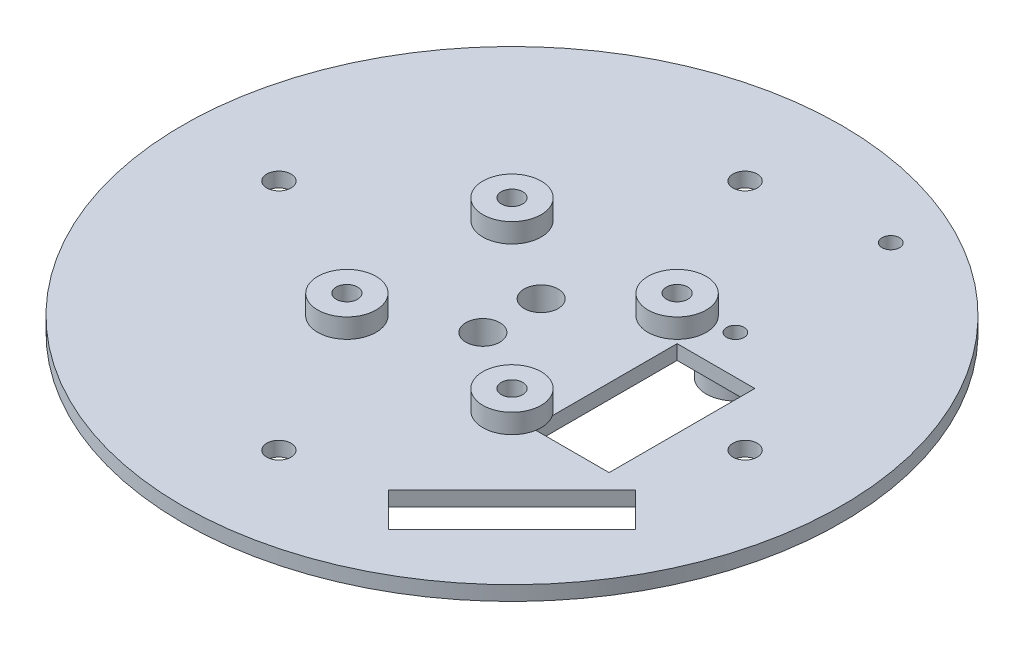
ISO-10303-21;
HEADER;
FILE_DESCRIPTION(('STEP AP214'),'2;1');
FILE_NAME('part.step','',(''),(''),'','','');
FILE_SCHEMA(('AUTOMOTIVE_DESIGN { 1 0 10303 214 1 1 1 1 }'));
ENDSEC;
DATA;
#1=APPLICATION_CONTEXT('core data for automotive mechanical design processes');
#2=APPLICATION_PROTOCOL_DEFINITION('international standard','automotive_design',2000,#1);
#3=PRODUCT_CONTEXT('',#1,'mechanical');
#4=PRODUCT('Part','Part','',(#3));
#5=PRODUCT_RELATED_PRODUCT_CATEGORY('part','',(#4));
#6=PRODUCT_DEFINITION_FORMATION('','',#4);
#7=PRODUCT_DEFINITION_CONTEXT('part definition',#1,'design');
#8=PRODUCT_DEFINITION('design','',#6,#7);
#9=PRODUCT_DEFINITION_SHAPE('','',#8);
#10=(LENGTH_UNIT() NAMED_UNIT(*) SI_UNIT(.MILLI.,.METRE.));
#11=(NAMED_UNIT(*) PLANE_ANGLE_UNIT() SI_UNIT($,.RADIAN.));
#12=(NAMED_UNIT(*) SI_UNIT($,.STERADIAN.) SOLID_ANGLE_UNIT());
#13=UNCERTAINTY_MEASURE_WITH_UNIT(LENGTH_MEASURE(1.E-05),#10,'distance_accuracy_value','');
#14=(GEOMETRIC_REPRESENTATION_CONTEXT(3) GLOBAL_UNCERTAINTY_ASSIGNED_CONTEXT((#13)) GLOBAL_UNIT_ASSIGNED_CONTEXT((#10,
#11,#12)) REPRESENTATION_CONTEXT('',''));
#15=CARTESIAN_POINT('',(0.,0.,0.));
#16=DIRECTION('',(0.,0.,1.));
#17=DIRECTION('',(1.,0.,0.));
#18=AXIS2_PLACEMENT_3D('',#15,#16,#17);
#19=CARTESIAN_POINT('',(0.,0.,0.));
#20=DIRECTION('',(0.,1.,0.));
#21=DIRECTION('',(0.,0.,1.));
#22=AXIS2_PLACEMENT_3D('',#19,#20,#21);
#23=PLANE('',#22);
#24=CARTESIAN_POINT('',(13.,0.,-26.));
#25=DIRECTION('',(0.,1.,0.));
#26=DIRECTION('',(0.,0.,1.));
#27=AXIS2_PLACEMENT_3D('',#24,#25,#26);
#28=CIRCLE('',#27,3.);
#29=CARTESIAN_POINT('',(13.,0.,-23.));
#30=VERTEX_POINT('',#29);
#31=EDGE_CURVE('E43',#30,#30,#28,.F.);
#32=ORIENTED_EDGE('',*,*,#31,.F.);
#33=EDGE_LOOP('',(#32));
#34=FACE_BOUND('',#33,.T.);
#35=CARTESIAN_POINT('',(-8.5,0.,8.5));
#36=DIRECTION('',(0.,1.,0.));
#37=DIRECTION('',(0.,0.,1.));
#38=AXIS2_PLACEMENT_3D('',#35,#36,#37);
#39=CIRCLE('',#38,1.1);
#40=CARTESIAN_POINT('',(-8.5,0.,9.6));
#41=VERTEX_POINT('',#40);
#42=EDGE_CURVE('E195',#41,#41,#39,.T.);
#43=ORIENTED_EDGE('',*,*,#42,.T.);
#44=EDGE_LOOP('',(#43));
#45=FACE_BOUND('',#44,.T.);
#46=CARTESIAN_POINT('',(8.5,0.,8.5));
#47=DIRECTION('',(0.,1.,0.));
#48=DIRECTION('',(0.,0.,-1.));
#49=AXIS2_PLACEMENT_3D('',#46,#47,#48);
#50=CIRCLE('',#49,1.1);
#51=CARTESIAN_POINT('',(8.5,0.,7.4));
#52=VERTEX_POINT('',#51);
#53=EDGE_CURVE('E200',#52,#52,#50,.T.);
#54=ORIENTED_EDGE('',*,*,#53,.T.);
#55=EDGE_LOOP('',(#54));
#56=FACE_BOUND('',#55,.T.);
#57=CARTESIAN_POINT('',(-8.5,0.,-8.5));
#58=DIRECTION('',(0.,1.,0.));
#59=DIRECTION('',(0.,0.,-1.));
#60=AXIS2_PLACEMENT_3D('',#57,#58,#59);
#61=CIRCLE('',#60,1.1);
#62=CARTESIAN_POINT('',(-8.5,0.,-9.6));
#63=VERTEX_POINT('',#62);
#64=EDGE_CURVE('E203',#63,#63,#61,.T.);
#65=ORIENTED_EDGE('',*,*,#64,.T.);
#66=EDGE_LOOP('',(#65));
#67=FACE_BOUND('',#66,.T.);
#68=CARTESIAN_POINT('',(8.5,0.,-8.5));
#69=DIRECTION('',(0.,1.,0.));
#70=DIRECTION('',(0.,0.,1.));
#71=AXIS2_PLACEMENT_3D('',#68,#69,#70);
#72=CIRCLE('',#71,1.1);
#73=CARTESIAN_POINT('',(8.5,0.,-7.4));
#74=VERTEX_POINT('',#73);
#75=EDGE_CURVE('E206',#74,#74,#72,.T.);
#76=ORIENTED_EDGE('',*,*,#75,.T.);
#77=EDGE_LOOP('',(#76));
#78=FACE_BOUND('',#77,.T.);
#79=CARTESIAN_POINT('',(-24.,0.,0.));
#80=DIRECTION('',(0.,1.,0.));
#81=DIRECTION('',(0.,0.,1.));
#82=AXIS2_PLACEMENT_3D('',#79,#80,#81);
#83=CIRCLE('',#82,1.25);
#84=CARTESIAN_POINT('',(-24.,0.,1.25));
#85=VERTEX_POINT('',#84);
#86=EDGE_CURVE('E209',#85,#85,#83,.T.);
#87=ORIENTED_EDGE('',*,*,#86,.T.);
#88=EDGE_LOOP('',(#87));
#89=FACE_BOUND('',#88,.T.);
#90=CARTESIAN_POINT('',(0.,0.,24.));
#91=DIRECTION('',(0.,1.,0.));
#92=DIRECTION('',(0.,0.,1.));
#93=AXIS2_PLACEMENT_3D('',#90,#91,#92);
#94=CIRCLE('',#93,1.25);
#95=CARTESIAN_POINT('',(0.,0.,25.25));
#96=VERTEX_POINT('',#95);
#97=EDGE_CURVE('E213',#96,#96,#94,.T.);
#98=ORIENTED_EDGE('',*,*,#97,.T.);
#99=EDGE_LOOP('',(#98));
#100=FACE_BOUND('',#99,.T.);
#101=CARTESIAN_POINT('',(24.,0.,0.));
#102=DIRECTION('',(0.,1.,0.));
#103=DIRECTION('',(0.,0.,1.));
#104=AXIS2_PLACEMENT_3D('',#101,#102,#103);
#105=CIRCLE('',#104,1.25);
#106=CARTESIAN_POINT('',(24.,0.,1.25));
#107=VERTEX_POINT('',#106);
#108=EDGE_CURVE('E219',#107,#107,#105,.T.);
#109=ORIENTED_EDGE('',*,*,#108,.T.);
#110=EDGE_LOOP('',(#109));
#111=FACE_BOUND('',#110,.T.);
#112=CARTESIAN_POINT('',(0.,0.,-24.));
#113=DIRECTION('',(0.,1.,0.));
#114=DIRECTION('',(0.,0.,1.));
#115=AXIS2_PLACEMENT_3D('',#112,#113,#114);
#116=CIRCLE('',#115,1.25);
#117=CARTESIAN_POINT('',(0.,0.,-22.75));
#118=VERTEX_POINT('',#117);
#119=EDGE_CURVE('E225',#118,#118,#116,.T.);
#120=ORIENTED_EDGE('',*,*,#119,.T.);
#121=EDGE_LOOP('',(#120));
#122=FACE_BOUND('',#121,.T.);
#123=DIRECTION('',(0.,0.,1.));
#124=VECTOR('',#123,1.);
#125=CARTESIAN_POINT('',(11.,0.,-6.));
#126=LINE('',#125,#124);
#127=CARTESIAN_POINT('',(11.,0.,-6.));
#128=VERTEX_POINT('',#127);
#129=CARTESIAN_POINT('',(11.,0.,9.));
#130=VERTEX_POINT('',#129);
#131=EDGE_CURVE('E231',#128,#130,#126,.T.);
#132=ORIENTED_EDGE('',*,*,#131,.T.);
#133=DIRECTION('',(1.,0.,0.));
#134=VECTOR('',#133,1.);
#135=CARTESIAN_POINT('',(11.,0.,9.));
#136=LINE('',#135,#134);
#137=CARTESIAN_POINT('',(19.,0.,9.));
#138=VERTEX_POINT('',#137);
#139=EDGE_CURVE('E250',#130,#138,#136,.T.);
#140=ORIENTED_EDGE('',*,*,#139,.T.);
#141=DIRECTION('',(0.,0.,-1.));
#142=VECTOR('',#141,1.);
#143=CARTESIAN_POINT('',(19.,0.,-6.));
#144=LINE('',#143,#142);
#145=CARTESIAN_POINT('',(19.,0.,-6.));
#146=VERTEX_POINT('',#145);
#147=EDGE_CURVE('E253',#138,#146,#144,.T.);
#148=ORIENTED_EDGE('',*,*,#147,.T.);
#149=DIRECTION('',(-1.,0.,0.));
#150=VECTOR('',#149,1.);
#151=CARTESIAN_POINT('',(11.,0.,-6.));
#152=LINE('',#151,#150);
#153=EDGE_CURVE('E238',#146,#128,#152,.T.);
#154=ORIENTED_EDGE('',*,*,#153,.T.);
#155=EDGE_LOOP('',(#132,#140,#148,#154));
#156=FACE_BOUND('',#155,.T.);
#157=CARTESIAN_POINT('',(0.,0.,0.));
#158=DIRECTION('',(0.,1.,0.));
#159=DIRECTION('',(0.,0.,1.));
#160=AXIS2_PLACEMENT_3D('',#157,#158,#159);
#161=CIRCLE('',#160,33.9299851282316);
#162=CARTESIAN_POINT('',(0.,0.,33.9299851282316));
#163=VERTEX_POINT('',#162);
#164=EDGE_CURVE('E310',#163,#163,#161,.T.);
#165=ORIENTED_EDGE('',*,*,#164,.F.);
#166=EDGE_LOOP('',(#165));
#167=FACE_BOUND('',#166,.T.);
#168=DIRECTION('',(-0.707106781186545,0.,-0.70710678118655));
#169=VECTOR('',#168,1.);
#170=CARTESIAN_POINT('',(25.4558441227156,0.,12.7279220613579));
#171=LINE('',#170,#169);
#172=CARTESIAN_POINT('',(25.4558441227156,0.,12.7279220613579));
#173=VERTEX_POINT('',#172);
#174=CARTESIAN_POINT('',(21.9203102167829,0.,9.19238815542524));
#175=VERTEX_POINT('',#174);
#176=EDGE_CURVE('E270',#173,#175,#171,.T.);
#177=ORIENTED_EDGE('',*,*,#176,.T.);
#178=DIRECTION('',(-0.707106781186555,0.,0.70710678118654));
#179=VECTOR('',#178,1.);
#180=CARTESIAN_POINT('',(21.9203102167829,0.,9.19238815542524));
#181=LINE('',#180,#179);
#182=CARTESIAN_POINT('',(9.19238815542494,0.,21.920310216783));
#183=VERTEX_POINT('',#182);
#184=EDGE_CURVE('E284',#175,#183,#181,.T.);
#185=ORIENTED_EDGE('',*,*,#184,.T.);
#186=DIRECTION('',(0.707106781186544,0.,0.707106781186551));
#187=VECTOR('',#186,1.);
#188=CARTESIAN_POINT('',(9.19238815542494,0.,21.920310216783));
#189=LINE('',#188,#187);
#190=CARTESIAN_POINT('',(12.7279220613577,0.,25.4558441227157));
#191=VERTEX_POINT('',#190);
#192=EDGE_CURVE('E287',#183,#191,#189,.T.);
#193=ORIENTED_EDGE('',*,*,#192,.T.);
#194=DIRECTION('',(0.707106781186551,0.,-0.707106781186544));
#195=VECTOR('',#194,1.);
#196=CARTESIAN_POINT('',(12.7279220613577,0.,25.4558441227157));
#197=LINE('',#196,#195);
#198=EDGE_CURVE('E274',#191,#173,#197,.T.);
#199=ORIENTED_EDGE('',*,*,#198,.T.);
#200=EDGE_LOOP('',(#177,#185,#193,#199));
#201=FACE_BOUND('',#200,.T.);
#202=DIRECTION('',(0.,0.,1.));
#203=VECTOR('',#202,1.);
#204=CARTESIAN_POINT('',(5.,0.,8.));
#205=LINE('',#204,#203);
#206=CARTESIAN_POINT('',(5.,0.,-7.));
#207=VERTEX_POINT('',#206);
#208=CARTESIAN_POINT('',(5.,0.,8.));
#209=VERTEX_POINT('',#208);
#210=EDGE_CURVE('E151',#207,#209,#205,.T.);
#211=ORIENTED_EDGE('',*,*,#210,.F.);
#212=DIRECTION('',(1.,0.,0.));
#213=VECTOR('',#212,1.);
#214=CARTESIAN_POINT('',(-5.,0.,-7.));
#215=LINE('',#214,#213);
#216=CARTESIAN_POINT('',(-5.,0.,-7.));
#217=VERTEX_POINT('',#216);
#218=EDGE_CURVE('E148',#217,#207,#215,.T.);
#219=ORIENTED_EDGE('',*,*,#218,.F.);
#220=DIRECTION('',(0.,0.,-1.));
#221=VECTOR('',#220,1.);
#222=CARTESIAN_POINT('',(-5.,0.,8.));
#223=LINE('',#222,#221);
#224=CARTESIAN_POINT('',(-5.,0.,8.));
#225=VERTEX_POINT('',#224);
#226=EDGE_CURVE('E55',#225,#217,#223,.T.);
#227=ORIENTED_EDGE('',*,*,#226,.F.);
#228=DIRECTION('',(-1.,0.,0.));
#229=VECTOR('',#228,1.);
#230=CARTESIAN_POINT('',(5.,0.,8.));
#231=LINE('',#230,#229);
#232=EDGE_CURVE('E50',#209,#225,#231,.T.);
#233=ORIENTED_EDGE('',*,*,#232,.F.);
#234=EDGE_LOOP('',(#211,#219,#227,#233));
#235=FACE_BOUND('',#234,.T.);
#236=CARTESIAN_POINT('',(13.,0.,-10.));
#237=DIRECTION('',(0.,1.,0.));
#238=DIRECTION('',(0.,0.,1.));
#239=AXIS2_PLACEMENT_3D('',#236,#237,#238);
#240=CIRCLE('',#239,3.);
#241=CARTESIAN_POINT('',(13.,0.,-7.));
#242=VERTEX_POINT('',#241);
#243=EDGE_CURVE('E11',#242,#242,#240,.F.);
#244=ORIENTED_EDGE('',*,*,#243,.F.);
#245=EDGE_LOOP('',(#244));
#246=FACE_BOUND('',#245,.T.);
#247=ADVANCED_FACE('F35',(#34,#45,#56,#67,#78,#89,#100,#111,#122,#156,#167,#201,#235,#246),#23,.F.);
#248=CARTESIAN_POINT('',(0.,1.5,0.));
#249=DIRECTION('',(0.,1.,0.));
#250=DIRECTION('',(0.,0.,1.));
#251=AXIS2_PLACEMENT_3D('',#248,#249,#250);
#252=PLANE('',#251);
#253=DIRECTION('',(1.,0.,0.));
#254=VECTOR('',#253,1.);
#255=CARTESIAN_POINT('',(11.,1.5,9.));
#256=LINE('',#255,#254);
#257=CARTESIAN_POINT('',(11.4580398915498,1.5,9.));
#258=VERTEX_POINT('',#257);
#259=CARTESIAN_POINT('',(19.,1.5,9.));
#260=VERTEX_POINT('',#259);
#261=EDGE_CURVE('E237',#258,#260,#256,.T.);
#262=ORIENTED_EDGE('',*,*,#261,.F.);
#263=CARTESIAN_POINT('',(8.5,1.5,8.5));
#264=DIRECTION('',(0.,1.,0.));
#265=DIRECTION('',(0.,0.,1.));
#266=AXIS2_PLACEMENT_3D('',#263,#264,#265);
#267=CIRCLE('',#266,3.);
#268=CARTESIAN_POINT('',(11.,1.5,6.8416876048223));
#269=VERTEX_POINT('',#268);
#270=EDGE_CURVE('E169',#269,#258,#267,.T.);
#271=ORIENTED_EDGE('',*,*,#270,.F.);
#272=DIRECTION('',(0.,0.,1.));
#273=VECTOR('',#272,1.);
#274=CARTESIAN_POINT('',(11.,1.5,-6.));
#275=LINE('',#274,#273);
#276=CARTESIAN_POINT('',(11.,1.5,-6.));
#277=VERTEX_POINT('',#276);
#278=EDGE_CURVE('E234',#277,#269,#275,.T.);
#279=ORIENTED_EDGE('',*,*,#278,.F.);
#280=DIRECTION('',(-1.,0.,0.));
#281=VECTOR('',#280,1.);
#282=CARTESIAN_POINT('',(11.,1.5,-6.));
#283=LINE('',#282,#281);
#284=CARTESIAN_POINT('',(19.,1.5,-6.));
#285=VERTEX_POINT('',#284);
#286=EDGE_CURVE('E245',#285,#277,#283,.T.);
#287=ORIENTED_EDGE('',*,*,#286,.F.);
#288=DIRECTION('',(0.,0.,-1.));
#289=VECTOR('',#288,1.);
#290=CARTESIAN_POINT('',(19.,1.5,-6.));
#291=LINE('',#290,#289);
#292=EDGE_CURVE('E242',#260,#285,#291,.T.);
#293=ORIENTED_EDGE('',*,*,#292,.F.);
#294=EDGE_LOOP('',(#262,#271,#279,#287,#293));
#295=FACE_BOUND('',#294,.T.);
#296=CARTESIAN_POINT('',(-8.5,1.5,-8.5));
#297=DIRECTION('',(0.,1.,0.));
#298=DIRECTION('',(0.,0.,1.));
#299=AXIS2_PLACEMENT_3D('',#296,#297,#298);
#300=CIRCLE('',#299,3.);
#301=CARTESIAN_POINT('',(-8.5,1.5,-5.5));
#302=VERTEX_POINT('',#301);
#303=EDGE_CURVE('E191',#302,#302,#300,.T.);
#304=ORIENTED_EDGE('',*,*,#303,.F.);
#305=EDGE_LOOP('',(#304));
#306=FACE_BOUND('',#305,.T.);
#307=CARTESIAN_POINT('',(0.,1.5,24.));
#308=DIRECTION('',(0.,1.,0.));
#309=DIRECTION('',(0.,0.,1.));
#310=AXIS2_PLACEMENT_3D('',#307,#308,#309);
#311=CIRCLE('',#310,1.25);
#312=CARTESIAN_POINT('',(0.,1.5,25.25));
#313=VERTEX_POINT('',#312);
#314=EDGE_CURVE('E216',#313,#313,#311,.T.);
#315=ORIENTED_EDGE('',*,*,#314,.F.);
#316=EDGE_LOOP('',(#315));
#317=FACE_BOUND('',#316,.T.);
#318=CARTESIAN_POINT('',(0.,1.5,-24.));
#319=DIRECTION('',(0.,1.,0.));
#320=DIRECTION('',(0.,0.,1.));
#321=AXIS2_PLACEMENT_3D('',#318,#319,#320);
#322=CIRCLE('',#321,1.25);
#323=CARTESIAN_POINT('',(0.,1.5,-22.75));
#324=VERTEX_POINT('',#323);
#325=EDGE_CURVE('E228',#324,#324,#322,.T.);
#326=ORIENTED_EDGE('',*,*,#325,.F.);
#327=EDGE_LOOP('',(#326));
#328=FACE_BOUND('',#327,.T.);
#329=DIRECTION('',(-0.707106781186555,0.,0.70710678118654));
#330=VECTOR('',#329,1.);
#331=CARTESIAN_POINT('',(21.9203102167829,1.5,9.19238815542524));
#332=LINE('',#331,#330);
#333=CARTESIAN_POINT('',(21.9203102167829,1.5,9.19238815542524));
#334=VERTEX_POINT('',#333);
#335=CARTESIAN_POINT('',(9.19238815542494,1.5,21.920310216783));
#336=VERTEX_POINT('',#335);
#337=EDGE_CURVE('E273',#334,#336,#332,.T.);
#338=ORIENTED_EDGE('',*,*,#337,.F.);
#339=DIRECTION('',(-0.707106781186545,0.,-0.70710678118655));
#340=VECTOR('',#339,1.);
#341=CARTESIAN_POINT('',(25.4558441227156,1.5,12.7279220613579));
#342=LINE('',#341,#340);
#343=CARTESIAN_POINT('',(25.4558441227156,1.5,12.7279220613579));
#344=VERTEX_POINT('',#343);
#345=EDGE_CURVE('E271',#344,#334,#342,.T.);
#346=ORIENTED_EDGE('',*,*,#345,.F.);
#347=DIRECTION('',(0.707106781186551,0.,-0.707106781186544));
#348=VECTOR('',#347,1.);
#349=CARTESIAN_POINT('',(12.7279220613577,1.5,25.4558441227157));
#350=LINE('',#349,#348);
#351=CARTESIAN_POINT('',(12.7279220613577,1.5,25.4558441227157));
#352=VERTEX_POINT('',#351);
#353=EDGE_CURVE('E279',#352,#344,#350,.T.);
#354=ORIENTED_EDGE('',*,*,#353,.F.);
#355=DIRECTION('',(0.707106781186544,0.,0.707106781186551));
#356=VECTOR('',#355,1.);
#357=CARTESIAN_POINT('',(9.19238815542494,1.5,21.920310216783));
#358=LINE('',#357,#356);
#359=EDGE_CURVE('E276',#336,#352,#358,.T.);
#360=ORIENTED_EDGE('',*,*,#359,.F.);
#361=EDGE_LOOP('',(#338,#346,#354,#360));
#362=FACE_BOUND('',#361,.T.);
#363=CARTESIAN_POINT('',(13.,1.5,-10.));
#364=DIRECTION('',(0.,1.,0.));
#365=DIRECTION('',(0.,0.,1.));
#366=AXIS2_PLACEMENT_3D('',#363,#364,#365);
#367=CIRCLE('',#366,0.900000000000002);
#368=CARTESIAN_POINT('',(13.,1.5,-9.1));
#369=VERTEX_POINT('',#368);
#370=EDGE_CURVE('E301',#369,#369,#367,.T.);
#371=ORIENTED_EDGE('',*,*,#370,.F.);
#372=EDGE_LOOP('',(#371));
#373=FACE_BOUND('',#372,.T.);
#374=CARTESIAN_POINT('',(0.,1.5,-3.));
#375=DIRECTION('',(0.,1.,0.));
#376=DIRECTION('',(0.,0.,1.));
#377=AXIS2_PLACEMENT_3D('',#374,#375,#376);
#378=CIRCLE('',#377,1.75);
#379=CARTESIAN_POINT('',(0.,1.5,-1.25));
#380=VERTEX_POINT('',#379);
#381=EDGE_CURVE('E307',#380,#380,#378,.T.);
#382=ORIENTED_EDGE('',*,*,#381,.F.);
#383=EDGE_LOOP('',(#382));
#384=FACE_BOUND('',#383,.T.);
#385=CARTESIAN_POINT('',(0.,1.5,0.));
#386=DIRECTION('',(0.,1.,0.));
#387=DIRECTION('',(0.,0.,1.));
#388=AXIS2_PLACEMENT_3D('',#385,#386,#387);
#389=CIRCLE('',#388,33.9299851282316);
#390=CARTESIAN_POINT('',(0.,1.5,33.9299851282316));
#391=VERTEX_POINT('',#390);
#392=EDGE_CURVE('E311',#391,#391,#389,.T.);
#393=ORIENTED_EDGE('',*,*,#392,.T.);
#394=EDGE_LOOP('',(#393));
#395=FACE_BOUND('',#394,.T.);
#396=CARTESIAN_POINT('',(0.,1.5,3.));
#397=DIRECTION('',(0.,1.,0.));
#398=DIRECTION('',(0.,0.,1.));
#399=AXIS2_PLACEMENT_3D('',#396,#397,#398);
#400=CIRCLE('',#399,1.75);
#401=CARTESIAN_POINT('',(0.,1.5,4.75));
#402=VERTEX_POINT('',#401);
#403=EDGE_CURVE('E304',#402,#402,#400,.T.);
#404=ORIENTED_EDGE('',*,*,#403,.F.);
#405=EDGE_LOOP('',(#404));
#406=FACE_BOUND('',#405,.T.);
#407=CARTESIAN_POINT('',(13.,1.5,-26.));
#408=DIRECTION('',(0.,1.,0.));
#409=DIRECTION('',(0.,0.,-1.));
#410=AXIS2_PLACEMENT_3D('',#407,#408,#409);
#411=CIRCLE('',#410,0.900000000000004);
#412=CARTESIAN_POINT('',(13.,1.5,-26.9));
#413=VERTEX_POINT('',#412);
#414=EDGE_CURVE('E267',#413,#413,#411,.T.);
#415=ORIENTED_EDGE('',*,*,#414,.F.);
#416=EDGE_LOOP('',(#415));
#417=FACE_BOUND('',#416,.T.);
#418=CARTESIAN_POINT('',(24.,1.5,0.));
#419=DIRECTION('',(0.,1.,0.));
#420=DIRECTION('',(0.,0.,1.));
#421=AXIS2_PLACEMENT_3D('',#418,#419,#420);
#422=CIRCLE('',#421,1.25);
#423=CARTESIAN_POINT('',(24.,1.5,1.25));
#424=VERTEX_POINT('',#423);
#425=EDGE_CURVE('E222',#424,#424,#422,.T.);
#426=ORIENTED_EDGE('',*,*,#425,.F.);
#427=EDGE_LOOP('',(#426));
#428=FACE_BOUND('',#427,.T.);
#429=CARTESIAN_POINT('',(-24.,1.5,0.));
#430=DIRECTION('',(0.,1.,0.));
#431=DIRECTION('',(0.,0.,1.));
#432=AXIS2_PLACEMENT_3D('',#429,#430,#431);
#433=CIRCLE('',#432,1.25);
#434=CARTESIAN_POINT('',(-24.,1.5,1.25));
#435=VERTEX_POINT('',#434);
#436=EDGE_CURVE('E210',#435,#435,#433,.T.);
#437=ORIENTED_EDGE('',*,*,#436,.F.);
#438=EDGE_LOOP('',(#437));
#439=FACE_BOUND('',#438,.T.);
#440=CARTESIAN_POINT('',(8.5,1.5,-8.5));
#441=DIRECTION('',(0.,1.,0.));
#442=DIRECTION('',(0.,0.,1.));
#443=AXIS2_PLACEMENT_3D('',#440,#441,#442);
#444=CIRCLE('',#443,3.);
#445=CARTESIAN_POINT('',(8.5,1.5,-5.5));
#446=VERTEX_POINT('',#445);
#447=EDGE_CURVE('E182',#446,#446,#444,.T.);
#448=ORIENTED_EDGE('',*,*,#447,.F.);
#449=EDGE_LOOP('',(#448));
#450=FACE_BOUND('',#449,.T.);
#451=CARTESIAN_POINT('',(-8.5,1.5,8.5));
#452=DIRECTION('',(0.,1.,0.));
#453=DIRECTION('',(0.,0.,1.));
#454=AXIS2_PLACEMENT_3D('',#451,#452,#453);
#455=CIRCLE('',#454,3.);
#456=CARTESIAN_POINT('',(-8.5,1.5,11.5));
#457=VERTEX_POINT('',#456);
#458=EDGE_CURVE('E155',#457,#457,#455,.T.);
#459=ORIENTED_EDGE('',*,*,#458,.F.);
#460=EDGE_LOOP('',(#459));
#461=FACE_BOUND('',#460,.T.);
#462=ADVANCED_FACE('F322',(#295,#306,#317,#328,#362,#373,#384,#395,#406,#417,#428,#439,#450,
#461),#252,.T.);
#463=CARTESIAN_POINT('',(0.,1.5,0.));
#464=DIRECTION('',(0.,-1.,0.));
#465=DIRECTION('',(0.,0.,-1.));
#466=AXIS2_PLACEMENT_3D('',#463,#464,#465);
#467=CYLINDRICAL_SURFACE('',#466,33.9299851282316);
#468=ORIENTED_EDGE('',*,*,#392,.F.);
#469=EDGE_LOOP('',(#468));
#470=FACE_BOUND('',#469,.T.);
#471=ORIENTED_EDGE('',*,*,#164,.T.);
#472=EDGE_LOOP('',(#471));
#473=FACE_BOUND('',#472,.T.);
#474=ADVANCED_FACE('F37',(#470,#473),#467,.T.);
#475=CARTESIAN_POINT('',(0.,1.5,-3.));
#476=DIRECTION('',(0.,-1.,0.));
#477=DIRECTION('',(0.,0.,-1.));
#478=AXIS2_PLACEMENT_3D('',#475,#476,#477);
#479=CYLINDRICAL_SURFACE('',#478,1.75);
#480=ORIENTED_EDGE('',*,*,#381,.T.);
#481=EDGE_LOOP('',(#480));
#482=FACE_BOUND('',#481,.T.);
#483=CARTESIAN_POINT('',(0.,-1.,-3.));
#484=DIRECTION('',(0.,-1.,0.));
#485=DIRECTION('',(0.,0.,-1.));
#486=AXIS2_PLACEMENT_3D('',#483,#484,#485);
#487=CIRCLE('',#486,1.75);
#488=CARTESIAN_POINT('',(0.,-1.,-4.75));
#489=VERTEX_POINT('',#488);
#490=EDGE_CURVE('E546',#489,#489,#487,.T.);
#491=ORIENTED_EDGE('',*,*,#490,.T.);
#492=EDGE_LOOP('',(#491));
#493=FACE_BOUND('',#492,.T.);
#494=ADVANCED_FACE('F491',(#482,#493),#479,.F.);
#495=CARTESIAN_POINT('',(0.,1.5,3.));
#496=DIRECTION('',(0.,-1.,0.));
#497=DIRECTION('',(0.,0.,-1.));
#498=AXIS2_PLACEMENT_3D('',#495,#496,#497);
#499=CYLINDRICAL_SURFACE('',#498,1.75);
#500=ORIENTED_EDGE('',*,*,#403,.T.);
#501=EDGE_LOOP('',(#500));
#502=FACE_BOUND('',#501,.T.);
#503=CARTESIAN_POINT('',(0.,-1.,3.));
#504=DIRECTION('',(0.,-1.,0.));
#505=DIRECTION('',(0.,0.,-1.));
#506=AXIS2_PLACEMENT_3D('',#503,#504,#505);
#507=CIRCLE('',#506,1.75);
#508=CARTESIAN_POINT('',(0.,-1.,1.25));
#509=VERTEX_POINT('',#508);
#510=EDGE_CURVE('E555',#509,#509,#507,.T.);
#511=ORIENTED_EDGE('',*,*,#510,.T.);
#512=EDGE_LOOP('',(#511));
#513=FACE_BOUND('',#512,.T.);
#514=ADVANCED_FACE('F487',(#502,#513),#499,.F.);
#515=CARTESIAN_POINT('',(13.,1.5,-10.));
#516=DIRECTION('',(0.,-1.,0.));
#517=DIRECTION('',(0.,0.,-1.));
#518=AXIS2_PLACEMENT_3D('',#515,#516,#517);
#519=CYLINDRICAL_SURFACE('',#518,0.900000000000002);
#520=ORIENTED_EDGE('',*,*,#370,.T.);
#521=EDGE_LOOP('',(#520));
#522=FACE_BOUND('',#521,.T.);
#523=CARTESIAN_POINT('',(13.,-2.5,-10.));
#524=DIRECTION('',(0.,-1.,0.));
#525=DIRECTION('',(0.,0.,-1.));
#526=AXIS2_PLACEMENT_3D('',#523,#524,#525);
#527=CIRCLE('',#526,0.900000000000002);
#528=CARTESIAN_POINT('',(13.,-2.5,-10.9));
#529=VERTEX_POINT('',#528);
#530=EDGE_CURVE('E549',#529,#529,#527,.T.);
#531=ORIENTED_EDGE('',*,*,#530,.T.);
#532=EDGE_LOOP('',(#531));
#533=FACE_BOUND('',#532,.T.);
#534=ADVANCED_FACE('F483',(#522,#533),#519,.F.);
#535=CARTESIAN_POINT('',(25.4558441227156,1.5,12.7279220613579));
#536=DIRECTION('',(-0.70710678118655,0.,0.707106781186544));
#537=DIRECTION('',(0.707106781186545,0.,0.70710678118655));
#538=AXIS2_PLACEMENT_3D('',#535,#536,#537);
#539=PLANE('',#538);
#540=ORIENTED_EDGE('',*,*,#176,.F.);
#541=DIRECTION('',(0.,-1.,0.));
#542=VECTOR('',#541,1.);
#543=CARTESIAN_POINT('',(25.4558441227156,1.5,12.7279220613579));
#544=LINE('',#543,#542);
#545=EDGE_CURVE('E281',#344,#173,#544,.T.);
#546=ORIENTED_EDGE('',*,*,#545,.F.);
#547=ORIENTED_EDGE('',*,*,#345,.T.);
#548=DIRECTION('',(0.,-1.,0.));
#549=VECTOR('',#548,1.);
#550=CARTESIAN_POINT('',(21.9203102167829,1.5,9.19238815542524));
#551=LINE('',#550,#549);
#552=EDGE_CURVE('E298',#334,#175,#551,.T.);
#553=ORIENTED_EDGE('',*,*,#552,.T.);
#554=EDGE_LOOP('',(#540,#546,#547,#553));
#555=FACE_BOUND('',#554,.T.);
#556=ADVANCED_FACE('F479',(#555),#539,.T.);
#557=CARTESIAN_POINT('',(21.9203102167829,1.5,9.19238815542524));
#558=DIRECTION('',(0.70710678118654,0.,0.707106781186555));
#559=DIRECTION('',(0.707106781186555,0.,-0.70710678118654));
#560=AXIS2_PLACEMENT_3D('',#557,#558,#559);
#561=PLANE('',#560);
#562=ORIENTED_EDGE('',*,*,#184,.F.);
#563=ORIENTED_EDGE('',*,*,#552,.F.);
#564=ORIENTED_EDGE('',*,*,#337,.T.);
#565=DIRECTION('',(0.,-1.,0.));
#566=VECTOR('',#565,1.);
#567=CARTESIAN_POINT('',(9.19238815542494,1.5,21.920310216783));
#568=LINE('',#567,#566);
#569=EDGE_CURVE('E296',#336,#183,#568,.T.);
#570=ORIENTED_EDGE('',*,*,#569,.T.);
#571=EDGE_LOOP('',(#562,#563,#564,#570));
#572=FACE_BOUND('',#571,.T.);
#573=ADVANCED_FACE('F475',(#572),#561,.T.);
#574=CARTESIAN_POINT('',(9.19238815542494,1.5,21.920310216783));
#575=DIRECTION('',(0.707106781186551,0.,-0.707106781186544));
#576=DIRECTION('',(-0.707106781186544,0.,-0.707106781186551));
#577=AXIS2_PLACEMENT_3D('',#574,#575,#576);
#578=PLANE('',#577);
#579=ORIENTED_EDGE('',*,*,#192,.F.);
#580=ORIENTED_EDGE('',*,*,#569,.F.);
#581=ORIENTED_EDGE('',*,*,#359,.T.);
#582=DIRECTION('',(0.,-1.,0.));
#583=VECTOR('',#582,1.);
#584=CARTESIAN_POINT('',(12.7279220613577,1.5,25.4558441227157));
#585=LINE('',#584,#583);
#586=EDGE_CURVE('E294',#352,#191,#585,.T.);
#587=ORIENTED_EDGE('',*,*,#586,.T.);
#588=EDGE_LOOP('',(#579,#580,#581,#587));
#589=FACE_BOUND('',#588,.T.);
#590=ADVANCED_FACE('F471',(#589),#578,.T.);
#591=CARTESIAN_POINT('',(12.7279220613577,1.5,25.4558441227157));
#592=DIRECTION('',(-0.707106781186544,0.,-0.707106781186551));
#593=DIRECTION('',(-0.707106781186551,0.,0.707106781186544));
#594=AXIS2_PLACEMENT_3D('',#591,#592,#593);
#595=PLANE('',#594);
#596=ORIENTED_EDGE('',*,*,#198,.F.);
#597=ORIENTED_EDGE('',*,*,#586,.F.);
#598=ORIENTED_EDGE('',*,*,#353,.T.);
#599=ORIENTED_EDGE('',*,*,#545,.T.);
#600=EDGE_LOOP('',(#596,#597,#598,#599));
#601=FACE_BOUND('',#600,.T.);
#602=ADVANCED_FACE('F467',(#601),#595,.T.);
#603=CARTESIAN_POINT('',(13.,1.5,-26.));
#604=DIRECTION('',(0.,-1.,0.));
#605=DIRECTION('',(0.,0.,-1.));
#606=AXIS2_PLACEMENT_3D('',#603,#604,#605);
#607=CYLINDRICAL_SURFACE('',#606,0.900000000000004);
#608=ORIENTED_EDGE('',*,*,#414,.T.);
#609=EDGE_LOOP('',(#608));
#610=FACE_BOUND('',#609,.T.);
#611=CARTESIAN_POINT('',(13.,-2.5,-26.));
#612=DIRECTION('',(0.,-1.,0.));
#613=DIRECTION('',(0.,0.,-1.));
#614=AXIS2_PLACEMENT_3D('',#611,#612,#613);
#615=CIRCLE('',#614,0.900000000000006);
#616=CARTESIAN_POINT('',(13.,-2.5,-26.9));
#617=VERTEX_POINT('',#616);
#618=EDGE_CURVE('E540',#617,#617,#615,.T.);
#619=ORIENTED_EDGE('',*,*,#618,.T.);
#620=EDGE_LOOP('',(#619));
#621=FACE_BOUND('',#620,.T.);
#622=ADVANCED_FACE('F463',(#610,#621),#607,.F.);
#623=CARTESIAN_POINT('',(11.,1.5,-6.));
#624=DIRECTION('',(1.,0.,0.));
#625=DIRECTION('',(0.,0.,-1.));
#626=AXIS2_PLACEMENT_3D('',#623,#624,#625);
#627=PLANE('',#626);
#628=ORIENTED_EDGE('',*,*,#131,.F.);
#629=DIRECTION('',(0.,-1.,0.));
#630=VECTOR('',#629,1.);
#631=CARTESIAN_POINT('',(11.,1.5,-6.));
#632=LINE('',#631,#630);
#633=EDGE_CURVE('E247',#277,#128,#632,.T.);
#634=ORIENTED_EDGE('',*,*,#633,.F.);
#635=ORIENTED_EDGE('',*,*,#278,.T.);
#636=DIRECTION('',(0.,0.,1.));
#637=VECTOR('',#636,1.);
#638=CARTESIAN_POINT('',(11.,1.5,-6.));
#639=LINE('',#638,#637);
#640=CARTESIAN_POINT('',(11.,1.5,9.));
#641=VERTEX_POINT('',#640);
#642=EDGE_CURVE('E173',#269,#641,#639,.T.);
#643=ORIENTED_EDGE('',*,*,#642,.T.);
#644=DIRECTION('',(0.,-1.,0.));
#645=VECTOR('',#644,1.);
#646=CARTESIAN_POINT('',(11.,1.5,9.));
#647=LINE('',#646,#645);
#648=EDGE_CURVE('E264',#641,#130,#647,.T.);
#649=ORIENTED_EDGE('',*,*,#648,.T.);
#650=EDGE_LOOP('',(#628,#634,#635,#643,#649));
#651=FACE_BOUND('',#650,.T.);
#652=ADVANCED_FACE('F459',(#651),#627,.T.);
#653=CARTESIAN_POINT('',(11.,1.5,9.));
#654=DIRECTION('',(0.,0.,-1.));
#655=DIRECTION('',(-1.,0.,0.));
#656=AXIS2_PLACEMENT_3D('',#653,#654,#655);
#657=PLANE('',#656);
#658=ORIENTED_EDGE('',*,*,#139,.F.);
#659=ORIENTED_EDGE('',*,*,#648,.F.);
#660=EDGE_CURVE('E239',#641,#258,#256,.T.);
#661=ORIENTED_EDGE('',*,*,#660,.T.);
#662=ORIENTED_EDGE('',*,*,#261,.T.);
#663=DIRECTION('',(0.,-1.,0.));
#664=VECTOR('',#663,1.);
#665=CARTESIAN_POINT('',(19.,1.5,9.));
#666=LINE('',#665,#664);
#667=EDGE_CURVE('E262',#260,#138,#666,.T.);
#668=ORIENTED_EDGE('',*,*,#667,.T.);
#669=EDGE_LOOP('',(#658,#659,#661,#662,#668));
#670=FACE_BOUND('',#669,.T.);
#671=ADVANCED_FACE('F455',(#670),#657,.T.);
#672=CARTESIAN_POINT('',(19.,1.5,-6.));
#673=DIRECTION('',(-1.,0.,0.));
#674=DIRECTION('',(0.,0.,1.));
#675=AXIS2_PLACEMENT_3D('',#672,#673,#674);
#676=PLANE('',#675);
#677=ORIENTED_EDGE('',*,*,#147,.F.);
#678=ORIENTED_EDGE('',*,*,#667,.F.);
#679=ORIENTED_EDGE('',*,*,#292,.T.);
#680=DIRECTION('',(0.,-1.,0.));
#681=VECTOR('',#680,1.);
#682=CARTESIAN_POINT('',(19.,1.5,-6.));
#683=LINE('',#682,#681);
#684=EDGE_CURVE('E260',#285,#146,#683,.T.);
#685=ORIENTED_EDGE('',*,*,#684,.T.);
#686=EDGE_LOOP('',(#677,#678,#679,#685));
#687=FACE_BOUND('',#686,.T.);
#688=ADVANCED_FACE('F451',(#687),#676,.T.);
#689=CARTESIAN_POINT('',(11.,1.5,-6.));
#690=DIRECTION('',(0.,0.,1.));
#691=DIRECTION('',(1.,0.,0.));
#692=AXIS2_PLACEMENT_3D('',#689,#690,#691);
#693=PLANE('',#692);
#694=ORIENTED_EDGE('',*,*,#153,.F.);
#695=ORIENTED_EDGE('',*,*,#684,.F.);
#696=ORIENTED_EDGE('',*,*,#286,.T.);
#697=ORIENTED_EDGE('',*,*,#633,.T.);
#698=EDGE_LOOP('',(#694,#695,#696,#697));
#699=FACE_BOUND('',#698,.T.);
#700=ADVANCED_FACE('F447',(#699),#693,.T.);
#701=CARTESIAN_POINT('',(0.,1.5,-24.));
#702=DIRECTION('',(0.,-1.,0.));
#703=DIRECTION('',(0.,0.,-1.));
#704=AXIS2_PLACEMENT_3D('',#701,#702,#703);
#705=CYLINDRICAL_SURFACE('',#704,1.25);
#706=ORIENTED_EDGE('',*,*,#325,.T.);
#707=EDGE_LOOP('',(#706));
#708=FACE_BOUND('',#707,.T.);
#709=ORIENTED_EDGE('',*,*,#119,.F.);
#710=EDGE_LOOP('',(#709));
#711=FACE_BOUND('',#710,.T.);
#712=ADVANCED_FACE('F443',(#708,#711),#705,.F.);
#713=CARTESIAN_POINT('',(24.,1.5,0.));
#714=DIRECTION('',(0.,-1.,0.));
#715=DIRECTION('',(0.,0.,-1.));
#716=AXIS2_PLACEMENT_3D('',#713,#714,#715);
#717=CYLINDRICAL_SURFACE('',#716,1.25);
#718=ORIENTED_EDGE('',*,*,#425,.T.);
#719=EDGE_LOOP('',(#718));
#720=FACE_BOUND('',#719,.T.);
#721=ORIENTED_EDGE('',*,*,#108,.F.);
#722=EDGE_LOOP('',(#721));
#723=FACE_BOUND('',#722,.T.);
#724=ADVANCED_FACE('F439',(#720,#723),#717,.F.);
#725=CARTESIAN_POINT('',(0.,1.5,24.));
#726=DIRECTION('',(0.,-1.,0.));
#727=DIRECTION('',(0.,0.,-1.));
#728=AXIS2_PLACEMENT_3D('',#725,#726,#727);
#729=CYLINDRICAL_SURFACE('',#728,1.25);
#730=ORIENTED_EDGE('',*,*,#314,.T.);
#731=EDGE_LOOP('',(#730));
#732=FACE_BOUND('',#731,.T.);
#733=ORIENTED_EDGE('',*,*,#97,.F.);
#734=EDGE_LOOP('',(#733));
#735=FACE_BOUND('',#734,.T.);
#736=ADVANCED_FACE('F435',(#732,#735),#729,.F.);
#737=CARTESIAN_POINT('',(-24.,1.5,0.));
#738=DIRECTION('',(0.,-1.,0.));
#739=DIRECTION('',(0.,0.,-1.));
#740=AXIS2_PLACEMENT_3D('',#737,#738,#739);
#741=CYLINDRICAL_SURFACE('',#740,1.25);
#742=ORIENTED_EDGE('',*,*,#436,.T.);
#743=EDGE_LOOP('',(#742));
#744=FACE_BOUND('',#743,.T.);
#745=ORIENTED_EDGE('',*,*,#86,.F.);
#746=EDGE_LOOP('',(#745));
#747=FACE_BOUND('',#746,.T.);
#748=ADVANCED_FACE('F431',(#744,#747),#741,.F.);
#749=CARTESIAN_POINT('',(8.5,1.5,-8.5));
#750=DIRECTION('',(0.,-1.,0.));
#751=DIRECTION('',(0.,0.,-1.));
#752=AXIS2_PLACEMENT_3D('',#749,#750,#751);
#753=CYLINDRICAL_SURFACE('',#752,1.1);
#754=ORIENTED_EDGE('',*,*,#75,.F.);
#755=EDGE_LOOP('',(#754));
#756=FACE_BOUND('',#755,.T.);
#757=CARTESIAN_POINT('',(8.5,3.5,-8.5));
#758=DIRECTION('',(0.,1.,0.));
#759=DIRECTION('',(0.,0.,1.));
#760=AXIS2_PLACEMENT_3D('',#757,#758,#759);
#761=CIRCLE('',#760,1.1);
#762=CARTESIAN_POINT('',(8.5,3.5,-7.4));
#763=VERTEX_POINT('',#762);
#764=EDGE_CURVE('E179',#763,#763,#761,.T.);
#765=ORIENTED_EDGE('',*,*,#764,.T.);
#766=EDGE_LOOP('',(#765));
#767=FACE_BOUND('',#766,.T.);
#768=ADVANCED_FACE('F427',(#756,#767),#753,.F.);
#769=CARTESIAN_POINT('',(-8.5,1.5,-8.5));
#770=DIRECTION('',(0.,-1.,0.));
#771=DIRECTION('',(0.,0.,-1.));
#772=AXIS2_PLACEMENT_3D('',#769,#770,#771);
#773=CYLINDRICAL_SURFACE('',#772,1.1);
#774=ORIENTED_EDGE('',*,*,#64,.F.);
#775=EDGE_LOOP('',(#774));
#776=FACE_BOUND('',#775,.T.);
#777=CARTESIAN_POINT('',(-8.5,3.5,-8.5));
#778=DIRECTION('',(0.,1.,0.));
#779=DIRECTION('',(0.,0.,1.));
#780=AXIS2_PLACEMENT_3D('',#777,#778,#779);
#781=CIRCLE('',#780,1.1);
#782=CARTESIAN_POINT('',(-8.5,3.5,-7.4));
#783=VERTEX_POINT('',#782);
#784=EDGE_CURVE('E186',#783,#783,#781,.T.);
#785=ORIENTED_EDGE('',*,*,#784,.T.);
#786=EDGE_LOOP('',(#785));
#787=FACE_BOUND('',#786,.T.);
#788=ADVANCED_FACE('F423',(#776,#787),#773,.F.);
#789=CARTESIAN_POINT('',(8.5,1.5,8.5));
#790=DIRECTION('',(0.,-1.,0.));
#791=DIRECTION('',(0.,0.,-1.));
#792=AXIS2_PLACEMENT_3D('',#789,#790,#791);
#793=CYLINDRICAL_SURFACE('',#792,1.1);
#794=ORIENTED_EDGE('',*,*,#53,.F.);
#795=EDGE_LOOP('',(#794));
#796=FACE_BOUND('',#795,.T.);
#797=CARTESIAN_POINT('',(8.5,3.5,8.5));
#798=DIRECTION('',(0.,1.,0.));
#799=DIRECTION('',(0.,0.,1.));
#800=AXIS2_PLACEMENT_3D('',#797,#798,#799);
#801=CIRCLE('',#800,1.1);
#802=CARTESIAN_POINT('',(8.5,3.5,9.6));
#803=VERTEX_POINT('',#802);
#804=EDGE_CURVE('E164',#803,#803,#801,.T.);
#805=ORIENTED_EDGE('',*,*,#804,.T.);
#806=EDGE_LOOP('',(#805));
#807=FACE_BOUND('',#806,.T.);
#808=ADVANCED_FACE('F419',(#796,#807),#793,.F.);
#809=CARTESIAN_POINT('',(-8.5,1.5,8.5));
#810=DIRECTION('',(0.,-1.,0.));
#811=DIRECTION('',(0.,0.,-1.));
#812=AXIS2_PLACEMENT_3D('',#809,#810,#811);
#813=CYLINDRICAL_SURFACE('',#812,1.1);
#814=ORIENTED_EDGE('',*,*,#42,.F.);
#815=EDGE_LOOP('',(#814));
#816=FACE_BOUND('',#815,.T.);
#817=CARTESIAN_POINT('',(-8.5,3.5,8.5));
#818=DIRECTION('',(0.,1.,0.));
#819=DIRECTION('',(0.,0.,1.));
#820=AXIS2_PLACEMENT_3D('',#817,#818,#819);
#821=CIRCLE('',#820,1.1);
#822=CARTESIAN_POINT('',(-8.5,3.5,9.6));
#823=VERTEX_POINT('',#822);
#824=EDGE_CURVE('E152',#823,#823,#821,.T.);
#825=ORIENTED_EDGE('',*,*,#824,.T.);
#826=EDGE_LOOP('',(#825));
#827=FACE_BOUND('',#826,.T.);
#828=ADVANCED_FACE('F412',(#816,#827),#813,.F.);
#829=CARTESIAN_POINT('',(-8.5,3.5,-8.5));
#830=DIRECTION('',(0.,1.,0.));
#831=DIRECTION('',(0.,0.,1.));
#832=AXIS2_PLACEMENT_3D('',#829,#830,#831);
#833=PLANE('',#832);
#834=CARTESIAN_POINT('',(-8.5,3.5,-8.5));
#835=DIRECTION('',(0.,1.,0.));
#836=DIRECTION('',(0.,0.,1.));
#837=AXIS2_PLACEMENT_3D('',#834,#835,#836);
#838=CIRCLE('',#837,3.);
#839=CARTESIAN_POINT('',(-8.5,3.5,-5.5));
#840=VERTEX_POINT('',#839);
#841=EDGE_CURVE('E192',#840,#840,#838,.T.);
#842=ORIENTED_EDGE('',*,*,#841,.T.);
#843=EDGE_LOOP('',(#842));
#844=FACE_BOUND('',#843,.T.);
#845=ORIENTED_EDGE('',*,*,#784,.F.);
#846=EDGE_LOOP('',(#845));
#847=FACE_BOUND('',#846,.T.);
#848=ADVANCED_FACE('F409',(#844,#847),#833,.T.);
#849=CARTESIAN_POINT('',(-8.5,3.5,-8.5));
#850=DIRECTION('',(0.,-1.,0.));
#851=DIRECTION('',(0.,0.,-1.));
#852=AXIS2_PLACEMENT_3D('',#849,#850,#851);
#853=CYLINDRICAL_SURFACE('',#852,3.);
#854=ORIENTED_EDGE('',*,*,#841,.F.);
#855=EDGE_LOOP('',(#854));
#856=FACE_BOUND('',#855,.T.);
#857=ORIENTED_EDGE('',*,*,#303,.T.);
#858=EDGE_LOOP('',(#857));
#859=FACE_BOUND('',#858,.T.);
#860=ADVANCED_FACE('F404',(#856,#859),#853,.T.);
#861=CARTESIAN_POINT('',(8.5,3.5,-8.5));
#862=DIRECTION('',(0.,1.,0.));
#863=DIRECTION('',(0.,0.,1.));
#864=AXIS2_PLACEMENT_3D('',#861,#862,#863);
#865=PLANE('',#864);
#866=CARTESIAN_POINT('',(8.5,3.5,-8.5));
#867=DIRECTION('',(0.,1.,0.));
#868=DIRECTION('',(0.,0.,1.));
#869=AXIS2_PLACEMENT_3D('',#866,#867,#868);
#870=CIRCLE('',#869,3.);
#871=CARTESIAN_POINT('',(8.5,3.5,-5.5));
#872=VERTEX_POINT('',#871);
#873=EDGE_CURVE('E183',#872,#872,#870,.T.);
#874=ORIENTED_EDGE('',*,*,#873,.T.);
#875=EDGE_LOOP('',(#874));
#876=FACE_BOUND('',#875,.T.);
#877=ORIENTED_EDGE('',*,*,#764,.F.);
#878=EDGE_LOOP('',(#877));
#879=FACE_BOUND('',#878,.T.);
#880=ADVANCED_FACE('F401',(#876,#879),#865,.T.);
#881=CARTESIAN_POINT('',(8.5,3.5,-8.5));
#882=DIRECTION('',(0.,-1.,0.));
#883=DIRECTION('',(0.,0.,-1.));
#884=AXIS2_PLACEMENT_3D('',#881,#882,#883);
#885=CYLINDRICAL_SURFACE('',#884,3.);
#886=ORIENTED_EDGE('',*,*,#873,.F.);
#887=EDGE_LOOP('',(#886));
#888=FACE_BOUND('',#887,.T.);
#889=ORIENTED_EDGE('',*,*,#447,.T.);
#890=EDGE_LOOP('',(#889));
#891=FACE_BOUND('',#890,.T.);
#892=ADVANCED_FACE('F393',(#888,#891),#885,.T.);
#893=CARTESIAN_POINT('',(8.5,3.5,8.5));
#894=DIRECTION('',(0.,1.,0.));
#895=DIRECTION('',(0.,0.,1.));
#896=AXIS2_PLACEMENT_3D('',#893,#894,#895);
#897=PLANE('',#896);
#898=CARTESIAN_POINT('',(8.5,3.5,8.5));
#899=DIRECTION('',(0.,1.,0.));
#900=DIRECTION('',(0.,0.,1.));
#901=AXIS2_PLACEMENT_3D('',#898,#899,#900);
#902=CIRCLE('',#901,3.);
#903=CARTESIAN_POINT('',(8.5,3.5,11.5));
#904=VERTEX_POINT('',#903);
#905=EDGE_CURVE('E170',#904,#904,#902,.T.);
#906=ORIENTED_EDGE('',*,*,#905,.T.);
#907=EDGE_LOOP('',(#906));
#908=FACE_BOUND('',#907,.T.);
#909=ORIENTED_EDGE('',*,*,#804,.F.);
#910=EDGE_LOOP('',(#909));
#911=FACE_BOUND('',#910,.T.);
#912=ADVANCED_FACE('F389',(#908,#911),#897,.T.);
#913=CARTESIAN_POINT('',(8.5,1.5,8.5));
#914=DIRECTION('',(0.,1.,0.));
#915=DIRECTION('',(0.,0.,1.));
#916=AXIS2_PLACEMENT_3D('',#913,#914,#915);
#917=PLANE('',#916);
#918=ORIENTED_EDGE('',*,*,#642,.F.);
#919=EDGE_CURVE('E174',#258,#269,#267,.T.);
#920=ORIENTED_EDGE('',*,*,#919,.F.);
#921=ORIENTED_EDGE('',*,*,#660,.F.);
#922=EDGE_LOOP('',(#918,#920,#921));
#923=FACE_BOUND('',#922,.T.);
#924=ADVANCED_FACE('F392',(#923),#917,.F.);
#925=CARTESIAN_POINT('',(8.5,3.5,8.5));
#926=DIRECTION('',(0.,-1.,0.));
#927=DIRECTION('',(0.,0.,-1.));
#928=AXIS2_PLACEMENT_3D('',#925,#926,#927);
#929=CYLINDRICAL_SURFACE('',#928,3.);
#930=ORIENTED_EDGE('',*,*,#905,.F.);
#931=EDGE_LOOP('',(#930));
#932=FACE_BOUND('',#931,.T.);
#933=ORIENTED_EDGE('',*,*,#919,.T.);
#934=ORIENTED_EDGE('',*,*,#270,.T.);
#935=EDGE_LOOP('',(#933,#934));
#936=FACE_BOUND('',#935,.T.);
#937=ADVANCED_FACE('F384',(#932,#936),#929,.T.);
#938=CARTESIAN_POINT('',(-8.5,3.5,8.5));
#939=DIRECTION('',(0.,1.,0.));
#940=DIRECTION('',(0.,0.,1.));
#941=AXIS2_PLACEMENT_3D('',#938,#939,#940);
#942=PLANE('',#941);
#943=CARTESIAN_POINT('',(-8.5,3.5,8.5));
#944=DIRECTION('',(0.,1.,0.));
#945=DIRECTION('',(0.,0.,1.));
#946=AXIS2_PLACEMENT_3D('',#943,#944,#945);
#947=CIRCLE('',#946,3.);
#948=CARTESIAN_POINT('',(-8.5,3.5,11.5));
#949=VERTEX_POINT('',#948);
#950=EDGE_CURVE('E161',#949,#949,#947,.T.);
#951=ORIENTED_EDGE('',*,*,#950,.T.);
#952=EDGE_LOOP('',(#951));
#953=FACE_BOUND('',#952,.T.);
#954=ORIENTED_EDGE('',*,*,#824,.F.);
#955=EDGE_LOOP('',(#954));
#956=FACE_BOUND('',#955,.T.);
#957=ADVANCED_FACE('F381',(#953,#956),#942,.T.);
#958=CARTESIAN_POINT('',(-8.5,3.5,8.5));
#959=DIRECTION('',(0.,-1.,0.));
#960=DIRECTION('',(0.,0.,-1.));
#961=AXIS2_PLACEMENT_3D('',#958,#959,#960);
#962=CYLINDRICAL_SURFACE('',#961,3.);
#963=ORIENTED_EDGE('',*,*,#950,.F.);
#964=EDGE_LOOP('',(#963));
#965=FACE_BOUND('',#964,.T.);
#966=ORIENTED_EDGE('',*,*,#458,.T.);
#967=EDGE_LOOP('',(#966));
#968=FACE_BOUND('',#967,.T.);
#969=ADVANCED_FACE('F368',(#965,#968),#962,.T.);
#970=CARTESIAN_POINT('',(0.,-1.,0.));
#971=DIRECTION('',(0.,-1.,0.));
#972=DIRECTION('',(0.,0.,-1.));
#973=AXIS2_PLACEMENT_3D('',#970,#971,#972);
#974=PLANE('',#973);
#975=ORIENTED_EDGE('',*,*,#510,.F.);
#976=EDGE_LOOP('',(#975));
#977=FACE_BOUND('',#976,.T.);
#978=DIRECTION('',(0.,0.,1.));
#979=VECTOR('',#978,1.);
#980=CARTESIAN_POINT('',(5.,-1.,8.));
#981=LINE('',#980,#979);
#982=CARTESIAN_POINT('',(5.,-1.,-7.));
#983=VERTEX_POINT('',#982);
#984=CARTESIAN_POINT('',(5.,-1.,8.));
#985=VERTEX_POINT('',#984);
#986=EDGE_CURVE('E138',#983,#985,#981,.T.);
#987=ORIENTED_EDGE('',*,*,#986,.T.);
#988=DIRECTION('',(-1.,0.,0.));
#989=VECTOR('',#988,1.);
#990=CARTESIAN_POINT('',(5.,-1.,8.));
#991=LINE('',#990,#989);
#992=CARTESIAN_POINT('',(-5.,-1.,8.));
#993=VERTEX_POINT('',#992);
#994=EDGE_CURVE('E127',#985,#993,#991,.T.);
#995=ORIENTED_EDGE('',*,*,#994,.T.);
#996=DIRECTION('',(0.,0.,-1.));
#997=VECTOR('',#996,1.);
#998=CARTESIAN_POINT('',(-5.,-1.,8.));
#999=LINE('',#998,#997);
#1000=CARTESIAN_POINT('',(-5.,-1.,-7.));
#1001=VERTEX_POINT('',#1000);
#1002=EDGE_CURVE('E137',#993,#1001,#999,.T.);
#1003=ORIENTED_EDGE('',*,*,#1002,.T.);
#1004=DIRECTION('',(1.,0.,0.));
#1005=VECTOR('',#1004,1.);
#1006=CARTESIAN_POINT('',(-5.,-1.,-7.));
#1007=LINE('',#1006,#1005);
#1008=EDGE_CURVE('E144',#1001,#983,#1007,.T.);
#1009=ORIENTED_EDGE('',*,*,#1008,.T.);
#1010=EDGE_LOOP('',(#987,#995,#1003,#1009));
#1011=FACE_BOUND('',#1010,.T.);
#1012=ORIENTED_EDGE('',*,*,#490,.F.);
#1013=EDGE_LOOP('',(#1012));
#1014=FACE_BOUND('',#1013,.T.);
#1015=ADVANCED_FACE('F141',(#977,#1011,#1014),#974,.T.);
#1016=CARTESIAN_POINT('',(5.,-1.,8.));
#1017=DIRECTION('',(-1.,0.,0.));
#1018=DIRECTION('',(0.,0.,1.));
#1019=AXIS2_PLACEMENT_3D('',#1016,#1017,#1018);
#1020=PLANE('',#1019);
#1021=ORIENTED_EDGE('',*,*,#210,.T.);
#1022=DIRECTION('',(0.,1.,0.));
#1023=VECTOR('',#1022,1.);
#1024=CARTESIAN_POINT('',(5.,-1.,8.));
#1025=LINE('',#1024,#1023);
#1026=EDGE_CURVE('E131',#985,#209,#1025,.T.);
#1027=ORIENTED_EDGE('',*,*,#1026,.F.);
#1028=ORIENTED_EDGE('',*,*,#986,.F.);
#1029=DIRECTION('',(0.,1.,0.));
#1030=VECTOR('',#1029,1.);
#1031=CARTESIAN_POINT('',(5.,-1.,-7.));
#1032=LINE('',#1031,#1030);
#1033=EDGE_CURVE('E560',#983,#207,#1032,.T.);
#1034=ORIENTED_EDGE('',*,*,#1033,.T.);
#1035=EDGE_LOOP('',(#1021,#1027,#1028,#1034));
#1036=FACE_BOUND('',#1035,.T.);
#1037=ADVANCED_FACE('F150',(#1036),#1020,.F.);
#1038=CARTESIAN_POINT('',(5.,-1.,8.));
#1039=DIRECTION('',(0.,0.,-1.));
#1040=DIRECTION('',(-1.,0.,0.));
#1041=AXIS2_PLACEMENT_3D('',#1038,#1039,#1040);
#1042=PLANE('',#1041);
#1043=ORIENTED_EDGE('',*,*,#232,.T.);
#1044=DIRECTION('',(0.,1.,0.));
#1045=VECTOR('',#1044,1.);
#1046=CARTESIAN_POINT('',(-5.,-1.,8.));
#1047=LINE('',#1046,#1045);
#1048=EDGE_CURVE('E134',#993,#225,#1047,.T.);
#1049=ORIENTED_EDGE('',*,*,#1048,.F.);
#1050=ORIENTED_EDGE('',*,*,#994,.F.);
#1051=ORIENTED_EDGE('',*,*,#1026,.T.);
#1052=EDGE_LOOP('',(#1043,#1049,#1050,#1051));
#1053=FACE_BOUND('',#1052,.T.);
#1054=ADVANCED_FACE('F129',(#1053),#1042,.F.);
#1055=CARTESIAN_POINT('',(-5.,-1.,8.));
#1056=DIRECTION('',(1.,0.,0.));
#1057=DIRECTION('',(0.,0.,-1.));
#1058=AXIS2_PLACEMENT_3D('',#1055,#1056,#1057);
#1059=PLANE('',#1058);
#1060=ORIENTED_EDGE('',*,*,#226,.T.);
#1061=DIRECTION('',(0.,1.,0.));
#1062=VECTOR('',#1061,1.);
#1063=CARTESIAN_POINT('',(-5.,-1.,-7.));
#1064=LINE('',#1063,#1062);
#1065=EDGE_CURVE('E157',#1001,#217,#1064,.T.);
#1066=ORIENTED_EDGE('',*,*,#1065,.F.);
#1067=ORIENTED_EDGE('',*,*,#1002,.F.);
#1068=ORIENTED_EDGE('',*,*,#1048,.T.);
#1069=EDGE_LOOP('',(#1060,#1066,#1067,#1068));
#1070=FACE_BOUND('',#1069,.T.);
#1071=ADVANCED_FACE('F372',(#1070),#1059,.F.);
#1072=CARTESIAN_POINT('',(-5.,-1.,-7.));
#1073=DIRECTION('',(0.,0.,1.));
#1074=DIRECTION('',(1.,0.,0.));
#1075=AXIS2_PLACEMENT_3D('',#1072,#1073,#1074);
#1076=PLANE('',#1075);
#1077=ORIENTED_EDGE('',*,*,#218,.T.);
#1078=ORIENTED_EDGE('',*,*,#1033,.F.);
#1079=ORIENTED_EDGE('',*,*,#1008,.F.);
#1080=ORIENTED_EDGE('',*,*,#1065,.T.);
#1081=EDGE_LOOP('',(#1077,#1078,#1079,#1080));
#1082=FACE_BOUND('',#1081,.T.);
#1083=ADVANCED_FACE('F361',(#1082),#1076,.F.);
#1084=CARTESIAN_POINT('',(13.,-2.5,-26.));
#1085=DIRECTION('',(0.,-1.,0.));
#1086=DIRECTION('',(0.,0.,-1.));
#1087=AXIS2_PLACEMENT_3D('',#1084,#1085,#1086);
#1088=PLANE('',#1087);
#1089=CARTESIAN_POINT('',(13.,-2.5,-26.));
#1090=DIRECTION('',(0.,-1.,0.));
#1091=DIRECTION('',(0.,0.,-1.));
#1092=AXIS2_PLACEMENT_3D('',#1089,#1090,#1091);
#1093=CIRCLE('',#1092,3.);
#1094=CARTESIAN_POINT('',(13.,-2.5,-29.));
#1095=VERTEX_POINT('',#1094);
#1096=EDGE_CURVE('E542',#1095,#1095,#1093,.T.);
#1097=ORIENTED_EDGE('',*,*,#1096,.T.);
#1098=EDGE_LOOP('',(#1097));
#1099=FACE_BOUND('',#1098,.T.);
#1100=ORIENTED_EDGE('',*,*,#618,.F.);
#1101=EDGE_LOOP('',(#1100));
#1102=FACE_BOUND('',#1101,.T.);
#1103=ADVANCED_FACE('F358',(#1099,#1102),#1088,.T.);
#1104=CARTESIAN_POINT('',(13.,-2.5,-26.));
#1105=DIRECTION('',(0.,1.,0.));
#1106=DIRECTION('',(0.,0.,1.));
#1107=AXIS2_PLACEMENT_3D('',#1104,#1105,#1106);
#1108=CYLINDRICAL_SURFACE('',#1107,3.);
#1109=ORIENTED_EDGE('',*,*,#1096,.F.);
#1110=EDGE_LOOP('',(#1109));
#1111=FACE_BOUND('',#1110,.T.);
#1112=ORIENTED_EDGE('',*,*,#31,.T.);
#1113=EDGE_LOOP('',(#1112));
#1114=FACE_BOUND('',#1113,.T.);
#1115=ADVANCED_FACE('F318',(#1111,#1114),#1108,.T.);
#1116=CARTESIAN_POINT('',(13.,-2.5,-10.));
#1117=DIRECTION('',(0.,-1.,0.));
#1118=DIRECTION('',(0.,0.,-1.));
#1119=AXIS2_PLACEMENT_3D('',#1116,#1117,#1118);
#1120=PLANE('',#1119);
#1121=CARTESIAN_POINT('',(13.,-2.5,-10.));
#1122=DIRECTION('',(0.,-1.,0.));
#1123=DIRECTION('',(0.,0.,-1.));
#1124=AXIS2_PLACEMENT_3D('',#1121,#1122,#1123);
#1125=CIRCLE('',#1124,3.);
#1126=CARTESIAN_POINT('',(13.,-2.5,-13.));
#1127=VERTEX_POINT('',#1126);
#1128=EDGE_CURVE('E543',#1127,#1127,#1125,.T.);
#1129=ORIENTED_EDGE('',*,*,#1128,.T.);
#1130=EDGE_LOOP('',(#1129));
#1131=FACE_BOUND('',#1130,.T.);
#1132=ORIENTED_EDGE('',*,*,#530,.F.);
#1133=EDGE_LOOP('',(#1132));
#1134=FACE_BOUND('',#1133,.T.);
#1135=ADVANCED_FACE('F348',(#1131,#1134),#1120,.T.);
#1136=CARTESIAN_POINT('',(13.,-2.5,-10.));
#1137=DIRECTION('',(0.,1.,0.));
#1138=DIRECTION('',(0.,0.,1.));
#1139=AXIS2_PLACEMENT_3D('',#1136,#1137,#1138);
#1140=CYLINDRICAL_SURFACE('',#1139,3.);
#1141=ORIENTED_EDGE('',*,*,#1128,.F.);
#1142=EDGE_LOOP('',(#1141));
#1143=FACE_BOUND('',#1142,.T.);
#1144=ORIENTED_EDGE('',*,*,#243,.T.);
#1145=EDGE_LOOP('',(#1144));
#1146=FACE_BOUND('',#1145,.T.);
#1147=ADVANCED_FACE('F346',(#1143,#1146),#1140,.T.);
#1148=CLOSED_SHELL('',(#247,#462,#474,#494,#514,#534,#556,#573,#590,#602,#622,#652,#671,#688,
#700,#712,#724,#736,#748,#768,#788,#808,#828,#848,#860,#880,#892,#912,#924,#937,#957,#969,#1015,
#1037,#1054,#1071,#1083,#1103,#1115,#1135,#1147));
#1149=MANIFOLD_SOLID_BREP('B2',#1148);
#1150=ADVANCED_BREP_SHAPE_REPRESENTATION('',(#18,#1149),#14);
#1151=SHAPE_DEFINITION_REPRESENTATION(#9,#1150);
ENDSEC;
END-ISO-10303-21;
